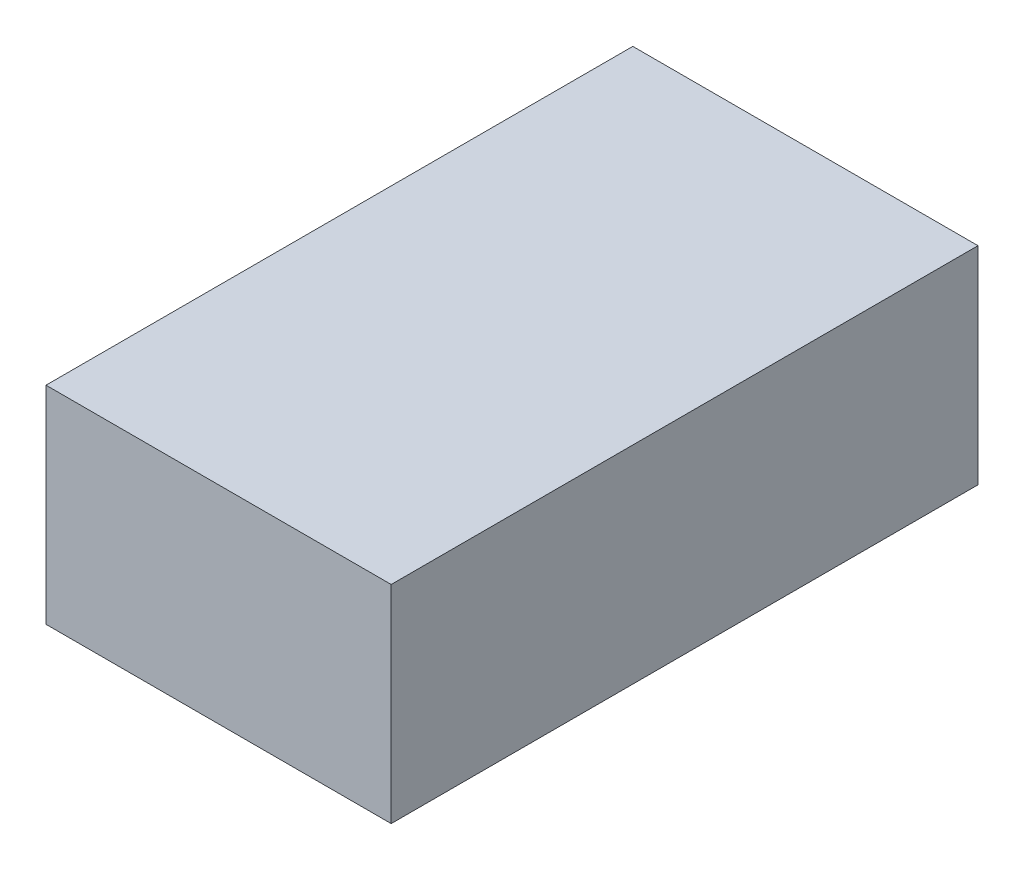
ISO-10303-21;
HEADER;
FILE_DESCRIPTION(('STEP AP214'),'2;1');
FILE_NAME('part.step','',(''),(''),'','','');
FILE_SCHEMA(('AUTOMOTIVE_DESIGN { 1 0 10303 214 1 1 1 1 }'));
ENDSEC;
DATA;
#1=APPLICATION_CONTEXT('core data for automotive mechanical design processes');
#2=APPLICATION_PROTOCOL_DEFINITION('international standard','automotive_design',2000,#1);
#3=PRODUCT_CONTEXT('',#1,'mechanical');
#4=PRODUCT('Part','Part','',(#3));
#5=PRODUCT_RELATED_PRODUCT_CATEGORY('part','',(#4));
#6=PRODUCT_DEFINITION_FORMATION('','',#4);
#7=PRODUCT_DEFINITION_CONTEXT('part definition',#1,'design');
#8=PRODUCT_DEFINITION('design','',#6,#7);
#9=PRODUCT_DEFINITION_SHAPE('','',#8);
#10=(LENGTH_UNIT() NAMED_UNIT(*) SI_UNIT(.MILLI.,.METRE.));
#11=(NAMED_UNIT(*) PLANE_ANGLE_UNIT() SI_UNIT($,.RADIAN.));
#12=(NAMED_UNIT(*) SI_UNIT($,.STERADIAN.) SOLID_ANGLE_UNIT());
#13=UNCERTAINTY_MEASURE_WITH_UNIT(LENGTH_MEASURE(1.E-05),#10,'distance_accuracy_value','');
#14=(GEOMETRIC_REPRESENTATION_CONTEXT(3) GLOBAL_UNCERTAINTY_ASSIGNED_CONTEXT((#13)) GLOBAL_UNIT_ASSIGNED_CONTEXT((#10,
#11,#12)) REPRESENTATION_CONTEXT('',''));
#15=CARTESIAN_POINT('',(0.,0.,0.));
#16=DIRECTION('',(0.,0.,1.));
#17=DIRECTION('',(1.,0.,0.));
#18=AXIS2_PLACEMENT_3D('',#15,#16,#17);
#19=CARTESIAN_POINT('',(0.,30.,42.5));
#20=DIRECTION('',(1.,0.,0.));
#21=DIRECTION('',(0.,0.,-1.));
#22=AXIS2_PLACEMENT_3D('',#19,#20,#21);
#23=PLANE('',#22);
#24=DIRECTION('',(0.,0.,1.));
#25=VECTOR('',#24,1.);
#26=CARTESIAN_POINT('',(0.,0.,42.5));
#27=LINE('',#26,#25);
#28=CARTESIAN_POINT('',(0.,0.,-42.5));
#29=VERTEX_POINT('',#28);
#30=CARTESIAN_POINT('',(0.,0.,42.5));
#31=VERTEX_POINT('',#30);
#32=EDGE_CURVE('E97',#29,#31,#27,.T.);
#33=ORIENTED_EDGE('',*,*,#32,.T.);
#34=DIRECTION('',(0.,-1.,0.));
#35=VECTOR('',#34,1.);
#36=CARTESIAN_POINT('',(0.,30.,42.5));
#37=LINE('',#36,#35);
#38=CARTESIAN_POINT('',(0.,30.,42.5));
#39=VERTEX_POINT('',#38);
#40=EDGE_CURVE('E11',#39,#31,#37,.T.);
#41=ORIENTED_EDGE('',*,*,#40,.F.);
#42=DIRECTION('',(0.,0.,1.));
#43=VECTOR('',#42,1.);
#44=CARTESIAN_POINT('',(0.,30.,42.5));
#45=LINE('',#44,#43);
#46=CARTESIAN_POINT('',(0.,30.,-42.5));
#47=VERTEX_POINT('',#46);
#48=EDGE_CURVE('E85',#47,#39,#45,.T.);
#49=ORIENTED_EDGE('',*,*,#48,.F.);
#50=DIRECTION('',(0.,-1.,0.));
#51=VECTOR('',#50,1.);
#52=CARTESIAN_POINT('',(0.,30.,-42.5));
#53=LINE('',#52,#51);
#54=EDGE_CURVE('E93',#47,#29,#53,.T.);
#55=ORIENTED_EDGE('',*,*,#54,.T.);
#56=EDGE_LOOP('',(#33,#41,#49,#55));
#57=FACE_BOUND('',#56,.T.);
#58=ADVANCED_FACE('F34',(#57),#23,.F.);
#59=CARTESIAN_POINT('',(0.,30.,42.5));
#60=DIRECTION('',(0.,0.,-1.));
#61=DIRECTION('',(-1.,0.,0.));
#62=AXIS2_PLACEMENT_3D('',#59,#60,#61);
#63=PLANE('',#62);
#64=DIRECTION('',(1.,0.,0.));
#65=VECTOR('',#64,1.);
#66=CARTESIAN_POINT('',(0.,0.,42.5));
#67=LINE('',#66,#65);
#68=CARTESIAN_POINT('',(50.,0.,42.5));
#69=VERTEX_POINT('',#68);
#70=EDGE_CURVE('E89',#31,#69,#67,.T.);
#71=ORIENTED_EDGE('',*,*,#70,.T.);
#72=DIRECTION('',(0.,-1.,0.));
#73=VECTOR('',#72,1.);
#74=CARTESIAN_POINT('',(50.,30.,42.5));
#75=LINE('',#74,#73);
#76=CARTESIAN_POINT('',(50.,30.,42.5));
#77=VERTEX_POINT('',#76);
#78=EDGE_CURVE('E42',#77,#69,#75,.T.);
#79=ORIENTED_EDGE('',*,*,#78,.F.);
#80=DIRECTION('',(1.,0.,0.));
#81=VECTOR('',#80,1.);
#82=CARTESIAN_POINT('',(0.,30.,42.5));
#83=LINE('',#82,#81);
#84=EDGE_CURVE('E80',#39,#77,#83,.T.);
#85=ORIENTED_EDGE('',*,*,#84,.F.);
#86=ORIENTED_EDGE('',*,*,#40,.T.);
#87=EDGE_LOOP('',(#71,#79,#85,#86));
#88=FACE_BOUND('',#87,.T.);
#89=ADVANCED_FACE('F88',(#88),#63,.F.);
#90=CARTESIAN_POINT('',(50.,30.,42.5));
#91=DIRECTION('',(-1.,0.,0.));
#92=DIRECTION('',(0.,0.,1.));
#93=AXIS2_PLACEMENT_3D('',#90,#91,#92);
#94=PLANE('',#93);
#95=DIRECTION('',(0.,0.,-1.));
#96=VECTOR('',#95,1.);
#97=CARTESIAN_POINT('',(50.,0.,42.5));
#98=LINE('',#97,#96);
#99=CARTESIAN_POINT('',(50.,0.,-42.5));
#100=VERTEX_POINT('',#99);
#101=EDGE_CURVE('E67',#69,#100,#98,.T.);
#102=ORIENTED_EDGE('',*,*,#101,.T.);
#103=DIRECTION('',(0.,-1.,0.));
#104=VECTOR('',#103,1.);
#105=CARTESIAN_POINT('',(50.,30.,-42.5));
#106=LINE('',#105,#104);
#107=CARTESIAN_POINT('',(50.,30.,-42.5));
#108=VERTEX_POINT('',#107);
#109=EDGE_CURVE('E90',#108,#100,#106,.T.);
#110=ORIENTED_EDGE('',*,*,#109,.F.);
#111=DIRECTION('',(0.,0.,-1.));
#112=VECTOR('',#111,1.);
#113=CARTESIAN_POINT('',(50.,30.,42.5));
#114=LINE('',#113,#112);
#115=EDGE_CURVE('E83',#77,#108,#114,.T.);
#116=ORIENTED_EDGE('',*,*,#115,.F.);
#117=ORIENTED_EDGE('',*,*,#78,.T.);
#118=EDGE_LOOP('',(#102,#110,#116,#117));
#119=FACE_BOUND('',#118,.T.);
#120=ADVANCED_FACE('F91',(#119),#94,.F.);
#121=CARTESIAN_POINT('',(0.,30.,-42.5));
#122=DIRECTION('',(0.,0.,1.));
#123=DIRECTION('',(1.,0.,0.));
#124=AXIS2_PLACEMENT_3D('',#121,#122,#123);
#125=PLANE('',#124);
#126=DIRECTION('',(-1.,0.,0.));
#127=VECTOR('',#126,1.);
#128=CARTESIAN_POINT('',(0.,0.,-42.5));
#129=LINE('',#128,#127);
#130=EDGE_CURVE('E73',#100,#29,#129,.T.);
#131=ORIENTED_EDGE('',*,*,#130,.T.);
#132=ORIENTED_EDGE('',*,*,#54,.F.);
#133=DIRECTION('',(-1.,0.,0.));
#134=VECTOR('',#133,1.);
#135=CARTESIAN_POINT('',(0.,30.,-42.5));
#136=LINE('',#135,#134);
#137=EDGE_CURVE('E50',#108,#47,#136,.T.);
#138=ORIENTED_EDGE('',*,*,#137,.F.);
#139=ORIENTED_EDGE('',*,*,#109,.T.);
#140=EDGE_LOOP('',(#131,#132,#138,#139));
#141=FACE_BOUND('',#140,.T.);
#142=ADVANCED_FACE('F104',(#141),#125,.F.);
#143=CARTESIAN_POINT('',(0.,30.,0.));
#144=DIRECTION('',(0.,-1.,0.));
#145=DIRECTION('',(0.,0.,-1.));
#146=AXIS2_PLACEMENT_3D('',#143,#144,#145);
#147=PLANE('',#146);
#148=ORIENTED_EDGE('',*,*,#48,.T.);
#149=ORIENTED_EDGE('',*,*,#84,.T.);
#150=ORIENTED_EDGE('',*,*,#115,.T.);
#151=ORIENTED_EDGE('',*,*,#137,.T.);
#152=EDGE_LOOP('',(#148,#149,#150,#151));
#153=FACE_BOUND('',#152,.T.);
#154=ADVANCED_FACE('F81',(#153),#147,.F.);
#155=CARTESIAN_POINT('',(0.,0.,0.));
#156=DIRECTION('',(0.,-1.,0.));
#157=DIRECTION('',(0.,0.,-1.));
#158=AXIS2_PLACEMENT_3D('',#155,#156,#157);
#159=PLANE('',#158);
#160=ORIENTED_EDGE('',*,*,#32,.F.);
#161=ORIENTED_EDGE('',*,*,#130,.F.);
#162=ORIENTED_EDGE('',*,*,#101,.F.);
#163=ORIENTED_EDGE('',*,*,#70,.F.);
#164=EDGE_LOOP('',(#160,#161,#162,#163));
#165=FACE_BOUND('',#164,.T.);
#166=ADVANCED_FACE('F107',(#165),#159,.T.);
#167=CLOSED_SHELL('',(#58,#89,#120,#142,#154,#166));
#168=MANIFOLD_SOLID_BREP('B2',#167);
#169=ADVANCED_BREP_SHAPE_REPRESENTATION('',(#18,#168),#14);
#170=SHAPE_DEFINITION_REPRESENTATION(#9,#169);
ENDSEC;
END-ISO-10303-21;
